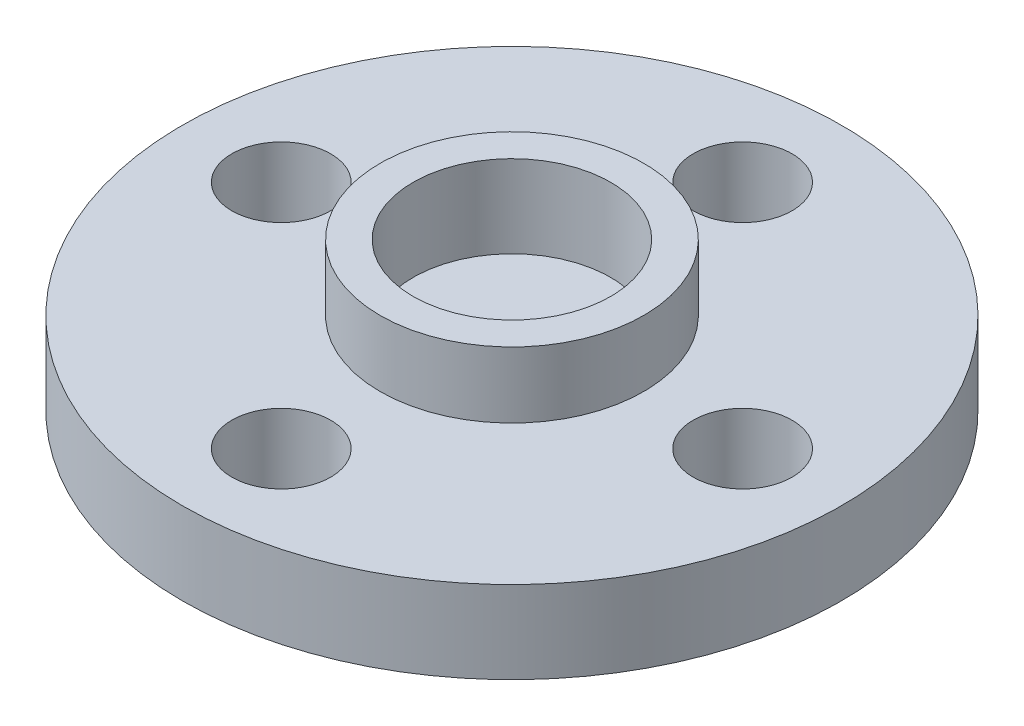
ISO-10303-21;
HEADER;
FILE_DESCRIPTION(('STEP AP214'),'2;1');
FILE_NAME('part.step','',(''),(''),'','','');
FILE_SCHEMA(('AUTOMOTIVE_DESIGN { 1 0 10303 214 1 1 1 1 }'));
ENDSEC;
DATA;
#1=APPLICATION_CONTEXT('core data for automotive mechanical design processes');
#2=APPLICATION_PROTOCOL_DEFINITION('international standard','automotive_design',2000,#1);
#3=PRODUCT_CONTEXT('',#1,'mechanical');
#4=PRODUCT('Part','Part','',(#3));
#5=PRODUCT_RELATED_PRODUCT_CATEGORY('part','',(#4));
#6=PRODUCT_DEFINITION_FORMATION('','',#4);
#7=PRODUCT_DEFINITION_CONTEXT('part definition',#1,'design');
#8=PRODUCT_DEFINITION('design','',#6,#7);
#9=PRODUCT_DEFINITION_SHAPE('','',#8);
#10=(LENGTH_UNIT() NAMED_UNIT(*) SI_UNIT(.MILLI.,.METRE.));
#11=(NAMED_UNIT(*) PLANE_ANGLE_UNIT() SI_UNIT($,.RADIAN.));
#12=(NAMED_UNIT(*) SI_UNIT($,.STERADIAN.) SOLID_ANGLE_UNIT());
#13=UNCERTAINTY_MEASURE_WITH_UNIT(LENGTH_MEASURE(1.E-05),#10,'distance_accuracy_value','');
#14=(GEOMETRIC_REPRESENTATION_CONTEXT(3) GLOBAL_UNCERTAINTY_ASSIGNED_CONTEXT((#13)) GLOBAL_UNIT_ASSIGNED_CONTEXT((#10,
#11,#12)) REPRESENTATION_CONTEXT('',''));
#15=CARTESIAN_POINT('',(0.,0.,0.));
#16=DIRECTION('',(0.,0.,1.));
#17=DIRECTION('',(1.,0.,0.));
#18=AXIS2_PLACEMENT_3D('',#15,#16,#17);
#19=CARTESIAN_POINT('',(0.,2.5,0.));
#20=DIRECTION('',(0.,-1.,0.));
#21=DIRECTION('',(0.,0.,-1.));
#22=AXIS2_PLACEMENT_3D('',#19,#20,#21);
#23=CYLINDRICAL_SURFACE('',#22,10.);
#24=CARTESIAN_POINT('',(0.,2.5,0.));
#25=DIRECTION('',(0.,1.,0.));
#26=DIRECTION('',(0.,0.,1.));
#27=AXIS2_PLACEMENT_3D('',#24,#25,#26);
#28=CIRCLE('',#27,10.);
#29=CARTESIAN_POINT('',(0.,2.5,10.));
#30=VERTEX_POINT('',#29);
#31=EDGE_CURVE('E10',#30,#30,#28,.T.);
#32=ORIENTED_EDGE('',*,*,#31,.F.);
#33=EDGE_LOOP('',(#32));
#34=FACE_BOUND('',#33,.T.);
#35=CARTESIAN_POINT('',(0.,0.,0.));
#36=DIRECTION('',(0.,1.,0.));
#37=DIRECTION('',(0.,0.,1.));
#38=AXIS2_PLACEMENT_3D('',#35,#36,#37);
#39=CIRCLE('',#38,10.);
#40=CARTESIAN_POINT('',(0.,0.,10.));
#41=VERTEX_POINT('',#40);
#42=EDGE_CURVE('E44',#41,#41,#39,.T.);
#43=ORIENTED_EDGE('',*,*,#42,.T.);
#44=EDGE_LOOP('',(#43));
#45=FACE_BOUND('',#44,.T.);
#46=ADVANCED_FACE('F41',(#34,#45),#23,.T.);
#47=CARTESIAN_POINT('',(0.,2.5,0.));
#48=DIRECTION('',(0.,1.,0.));
#49=DIRECTION('',(0.,0.,1.));
#50=AXIS2_PLACEMENT_3D('',#47,#48,#49);
#51=PLANE('',#50);
#52=CARTESIAN_POINT('',(0.,2.5,-7.));
#53=DIRECTION('',(0.,1.,0.));
#54=DIRECTION('',(0.,0.,1.));
#55=AXIS2_PLACEMENT_3D('',#52,#53,#54);
#56=CIRCLE('',#55,1.5);
#57=CARTESIAN_POINT('',(0.,2.5,-5.5));
#58=VERTEX_POINT('',#57);
#59=EDGE_CURVE('E64',#58,#58,#56,.F.);
#60=ORIENTED_EDGE('',*,*,#59,.T.);
#61=EDGE_LOOP('',(#60));
#62=FACE_BOUND('',#61,.T.);
#63=CARTESIAN_POINT('',(7.,2.5,0.));
#64=DIRECTION('',(0.,1.,0.));
#65=DIRECTION('',(0.,0.,1.));
#66=AXIS2_PLACEMENT_3D('',#63,#64,#65);
#67=CIRCLE('',#66,1.5);
#68=CARTESIAN_POINT('',(7.,2.5,1.50000000000002));
#69=VERTEX_POINT('',#68);
#70=EDGE_CURVE('E67',#69,#69,#67,.F.);
#71=ORIENTED_EDGE('',*,*,#70,.T.);
#72=EDGE_LOOP('',(#71));
#73=FACE_BOUND('',#72,.T.);
#74=CARTESIAN_POINT('',(0.,2.5,7.));
#75=DIRECTION('',(0.,1.,0.));
#76=DIRECTION('',(0.,0.,1.));
#77=AXIS2_PLACEMENT_3D('',#74,#75,#76);
#78=CIRCLE('',#77,1.5);
#79=CARTESIAN_POINT('',(0.,2.5,8.5));
#80=VERTEX_POINT('',#79);
#81=EDGE_CURVE('E70',#80,#80,#78,.F.);
#82=ORIENTED_EDGE('',*,*,#81,.T.);
#83=EDGE_LOOP('',(#82));
#84=FACE_BOUND('',#83,.T.);
#85=CARTESIAN_POINT('',(-7.,2.5,0.));
#86=DIRECTION('',(0.,1.,0.));
#87=DIRECTION('',(0.,0.,1.));
#88=AXIS2_PLACEMENT_3D('',#85,#86,#87);
#89=CIRCLE('',#88,1.5);
#90=CARTESIAN_POINT('',(-7.,2.5,1.49999999999993));
#91=VERTEX_POINT('',#90);
#92=EDGE_CURVE('E73',#91,#91,#89,.F.);
#93=ORIENTED_EDGE('',*,*,#92,.T.);
#94=EDGE_LOOP('',(#93));
#95=FACE_BOUND('',#94,.T.);
#96=CARTESIAN_POINT('',(0.,2.5,0.));
#97=DIRECTION('',(0.,1.,0.));
#98=DIRECTION('',(0.,0.,1.));
#99=AXIS2_PLACEMENT_3D('',#96,#97,#98);
#100=CIRCLE('',#99,4.);
#101=CARTESIAN_POINT('',(0.,2.5,4.));
#102=VERTEX_POINT('',#101);
#103=EDGE_CURVE('E53',#102,#102,#100,.T.);
#104=ORIENTED_EDGE('',*,*,#103,.F.);
#105=EDGE_LOOP('',(#104));
#106=FACE_BOUND('',#105,.T.);
#107=ORIENTED_EDGE('',*,*,#31,.T.);
#108=EDGE_LOOP('',(#107));
#109=FACE_BOUND('',#108,.T.);
#110=ADVANCED_FACE('F95',(#62,#73,#84,#95,#106,#109),#51,.T.);
#111=CARTESIAN_POINT('',(0.,0.,0.));
#112=DIRECTION('',(0.,1.,0.));
#113=DIRECTION('',(0.,0.,1.));
#114=AXIS2_PLACEMENT_3D('',#111,#112,#113);
#115=PLANE('',#114);
#116=CARTESIAN_POINT('',(0.,0.,-7.));
#117=DIRECTION('',(0.,1.,0.));
#118=DIRECTION('',(0.,0.,1.));
#119=AXIS2_PLACEMENT_3D('',#116,#117,#118);
#120=CIRCLE('',#119,1.5);
#121=CARTESIAN_POINT('',(0.,0.,-5.5));
#122=VERTEX_POINT('',#121);
#123=EDGE_CURVE('E76',#122,#122,#120,.F.);
#124=ORIENTED_EDGE('',*,*,#123,.F.);
#125=EDGE_LOOP('',(#124));
#126=FACE_BOUND('',#125,.T.);
#127=CARTESIAN_POINT('',(7.,0.,0.));
#128=DIRECTION('',(0.,1.,0.));
#129=DIRECTION('',(0.,0.,1.));
#130=AXIS2_PLACEMENT_3D('',#127,#128,#129);
#131=CIRCLE('',#130,1.5);
#132=CARTESIAN_POINT('',(7.,0.,1.50000000000002));
#133=VERTEX_POINT('',#132);
#134=EDGE_CURVE('E83',#133,#133,#131,.F.);
#135=ORIENTED_EDGE('',*,*,#134,.F.);
#136=EDGE_LOOP('',(#135));
#137=FACE_BOUND('',#136,.T.);
#138=CARTESIAN_POINT('',(0.,0.,7.));
#139=DIRECTION('',(0.,1.,0.));
#140=DIRECTION('',(0.,0.,1.));
#141=AXIS2_PLACEMENT_3D('',#138,#139,#140);
#142=CIRCLE('',#141,1.5);
#143=CARTESIAN_POINT('',(0.,0.,8.5));
#144=VERTEX_POINT('',#143);
#145=EDGE_CURVE('E80',#144,#144,#142,.F.);
#146=ORIENTED_EDGE('',*,*,#145,.F.);
#147=EDGE_LOOP('',(#146));
#148=FACE_BOUND('',#147,.T.);
#149=CARTESIAN_POINT('',(-7.,0.,0.));
#150=DIRECTION('',(0.,1.,0.));
#151=DIRECTION('',(0.,0.,1.));
#152=AXIS2_PLACEMENT_3D('',#149,#150,#151);
#153=CIRCLE('',#152,1.5);
#154=CARTESIAN_POINT('',(-7.,0.,1.49999999999993));
#155=VERTEX_POINT('',#154);
#156=EDGE_CURVE('E77',#155,#155,#153,.F.);
#157=ORIENTED_EDGE('',*,*,#156,.F.);
#158=EDGE_LOOP('',(#157));
#159=FACE_BOUND('',#158,.T.);
#160=ORIENTED_EDGE('',*,*,#42,.F.);
#161=EDGE_LOOP('',(#160));
#162=FACE_BOUND('',#161,.T.);
#163=ADVANCED_FACE('F91',(#126,#137,#148,#159,#162),#115,.F.);
#164=CARTESIAN_POINT('',(0.,4.5,0.));
#165=DIRECTION('',(0.,1.,0.));
#166=DIRECTION('',(0.,0.,1.));
#167=AXIS2_PLACEMENT_3D('',#164,#165,#166);
#168=PLANE('',#167);
#169=CARTESIAN_POINT('',(0.,4.5,0.));
#170=DIRECTION('',(0.,1.,0.));
#171=DIRECTION('',(0.,0.,1.));
#172=AXIS2_PLACEMENT_3D('',#169,#170,#171);
#173=CIRCLE('',#172,4.);
#174=CARTESIAN_POINT('',(0.,4.5,4.));
#175=VERTEX_POINT('',#174);
#176=EDGE_CURVE('E51',#175,#175,#173,.T.);
#177=ORIENTED_EDGE('',*,*,#176,.T.);
#178=EDGE_LOOP('',(#177));
#179=FACE_BOUND('',#178,.T.);
#180=CARTESIAN_POINT('',(0.,4.5,0.));
#181=DIRECTION('',(0.,1.,0.));
#182=DIRECTION('',(0.,0.,1.));
#183=AXIS2_PLACEMENT_3D('',#180,#181,#182);
#184=CIRCLE('',#183,3.);
#185=CARTESIAN_POINT('',(0.,4.5,3.));
#186=VERTEX_POINT('',#185);
#187=EDGE_CURVE('E56',#186,#186,#184,.T.);
#188=ORIENTED_EDGE('',*,*,#187,.F.);
#189=EDGE_LOOP('',(#188));
#190=FACE_BOUND('',#189,.T.);
#191=ADVANCED_FACE('F94',(#179,#190),#168,.T.);
#192=CARTESIAN_POINT('',(0.,4.5,0.));
#193=DIRECTION('',(0.,-1.,0.));
#194=DIRECTION('',(0.,0.,-1.));
#195=AXIS2_PLACEMENT_3D('',#192,#193,#194);
#196=CYLINDRICAL_SURFACE('',#195,4.);
#197=ORIENTED_EDGE('',*,*,#176,.F.);
#198=EDGE_LOOP('',(#197));
#199=FACE_BOUND('',#198,.T.);
#200=ORIENTED_EDGE('',*,*,#103,.T.);
#201=EDGE_LOOP('',(#200));
#202=FACE_BOUND('',#201,.T.);
#203=ADVANCED_FACE('F117',(#199,#202),#196,.T.);
#204=CARTESIAN_POINT('',(0.,4.5,0.));
#205=DIRECTION('',(0.,-1.,0.));
#206=DIRECTION('',(0.,0.,-1.));
#207=AXIS2_PLACEMENT_3D('',#204,#205,#206);
#208=CYLINDRICAL_SURFACE('',#207,3.);
#209=ORIENTED_EDGE('',*,*,#187,.T.);
#210=EDGE_LOOP('',(#209));
#211=FACE_BOUND('',#210,.T.);
#212=CARTESIAN_POINT('',(0.,2.,0.));
#213=DIRECTION('',(0.,1.,0.));
#214=DIRECTION('',(0.,0.,1.));
#215=AXIS2_PLACEMENT_3D('',#212,#213,#214);
#216=CIRCLE('',#215,3.);
#217=CARTESIAN_POINT('',(0.,2.,3.));
#218=VERTEX_POINT('',#217);
#219=EDGE_CURVE('E61',#218,#218,#216,.T.);
#220=ORIENTED_EDGE('',*,*,#219,.F.);
#221=EDGE_LOOP('',(#220));
#222=FACE_BOUND('',#221,.T.);
#223=ADVANCED_FACE('F120',(#211,#222),#208,.F.);
#224=CARTESIAN_POINT('',(0.,2.,0.));
#225=DIRECTION('',(0.,1.,0.));
#226=DIRECTION('',(0.,0.,1.));
#227=AXIS2_PLACEMENT_3D('',#224,#225,#226);
#228=PLANE('',#227);
#229=ORIENTED_EDGE('',*,*,#219,.T.);
#230=EDGE_LOOP('',(#229));
#231=FACE_BOUND('',#230,.T.);
#232=ADVANCED_FACE('F126',(#231),#228,.T.);
#233=CARTESIAN_POINT('',(-7.,4.5,0.));
#234=DIRECTION('',(0.,-1.,0.));
#235=DIRECTION('',(0.,0.,-1.));
#236=AXIS2_PLACEMENT_3D('',#233,#234,#235);
#237=CYLINDRICAL_SURFACE('',#236,1.5);
#238=ORIENTED_EDGE('',*,*,#92,.F.);
#239=EDGE_LOOP('',(#238));
#240=FACE_BOUND('',#239,.T.);
#241=ORIENTED_EDGE('',*,*,#156,.T.);
#242=EDGE_LOOP('',(#241));
#243=FACE_BOUND('',#242,.T.);
#244=ADVANCED_FACE('F129',(#240,#243),#237,.F.);
#245=CARTESIAN_POINT('',(0.,4.5,7.));
#246=DIRECTION('',(0.,-1.,0.));
#247=DIRECTION('',(0.,0.,-1.));
#248=AXIS2_PLACEMENT_3D('',#245,#246,#247);
#249=CYLINDRICAL_SURFACE('',#248,1.5);
#250=ORIENTED_EDGE('',*,*,#81,.F.);
#251=EDGE_LOOP('',(#250));
#252=FACE_BOUND('',#251,.T.);
#253=ORIENTED_EDGE('',*,*,#145,.T.);
#254=EDGE_LOOP('',(#253));
#255=FACE_BOUND('',#254,.T.);
#256=ADVANCED_FACE('F133',(#252,#255),#249,.F.);
#257=CARTESIAN_POINT('',(7.,4.5,0.));
#258=DIRECTION('',(0.,-1.,0.));
#259=DIRECTION('',(0.,0.,-1.));
#260=AXIS2_PLACEMENT_3D('',#257,#258,#259);
#261=CYLINDRICAL_SURFACE('',#260,1.5);
#262=ORIENTED_EDGE('',*,*,#70,.F.);
#263=EDGE_LOOP('',(#262));
#264=FACE_BOUND('',#263,.T.);
#265=ORIENTED_EDGE('',*,*,#134,.T.);
#266=EDGE_LOOP('',(#265));
#267=FACE_BOUND('',#266,.T.);
#268=ADVANCED_FACE('F137',(#264,#267),#261,.F.);
#269=CARTESIAN_POINT('',(0.,4.5,-7.));
#270=DIRECTION('',(0.,-1.,0.));
#271=DIRECTION('',(0.,0.,-1.));
#272=AXIS2_PLACEMENT_3D('',#269,#270,#271);
#273=CYLINDRICAL_SURFACE('',#272,1.5);
#274=ORIENTED_EDGE('',*,*,#59,.F.);
#275=EDGE_LOOP('',(#274));
#276=FACE_BOUND('',#275,.T.);
#277=ORIENTED_EDGE('',*,*,#123,.T.);
#278=EDGE_LOOP('',(#277));
#279=FACE_BOUND('',#278,.T.);
#280=ADVANCED_FACE('F89',(#276,#279),#273,.F.);
#281=CLOSED_SHELL('',(#46,#110,#163,#191,#203,#223,#232,#244,#256,#268,#280));
#282=MANIFOLD_SOLID_BREP('B2',#281);
#283=ADVANCED_BREP_SHAPE_REPRESENTATION('',(#18,#282),#14);
#284=SHAPE_DEFINITION_REPRESENTATION(#9,#283);
ENDSEC;
END-ISO-10303-21;
